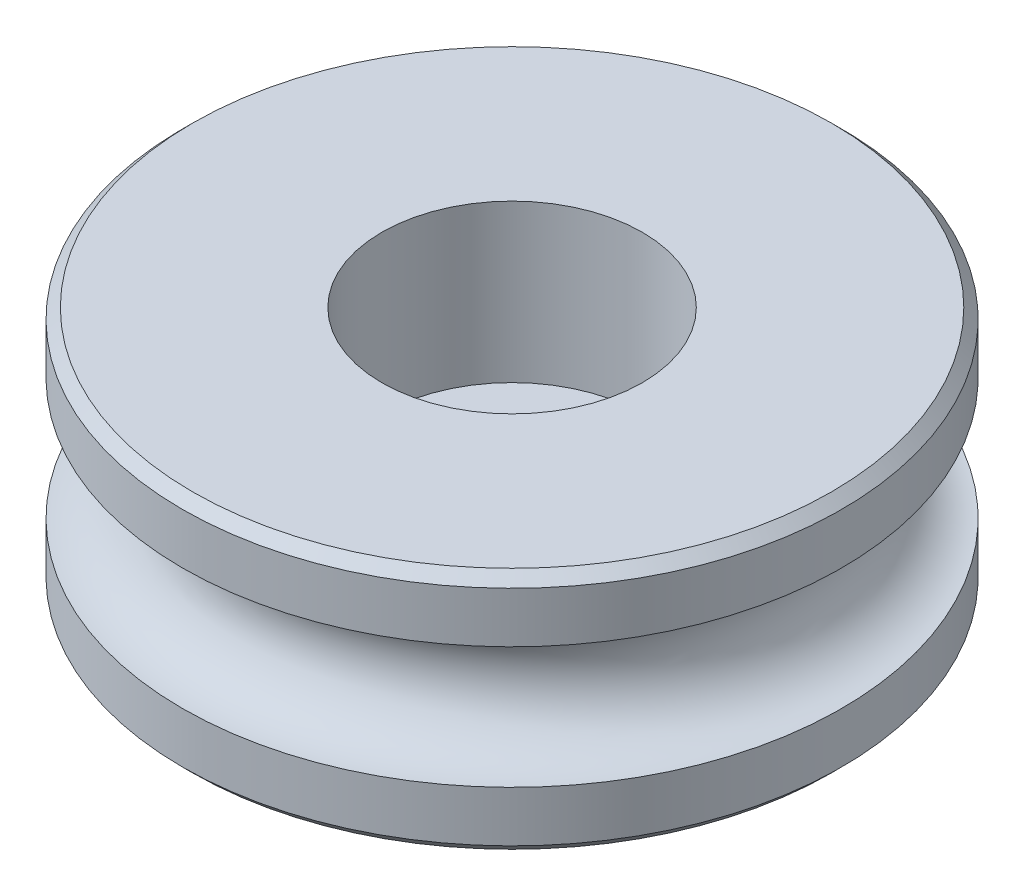
ISO-10303-21;
HEADER;
FILE_DESCRIPTION(('STEP AP214'),'2;1');
FILE_NAME('part.step','',(''),(''),'','','');
FILE_SCHEMA(('AUTOMOTIVE_DESIGN { 1 0 10303 214 1 1 1 1 }'));
ENDSEC;
DATA;
#1=APPLICATION_CONTEXT('core data for automotive mechanical design processes');
#2=APPLICATION_PROTOCOL_DEFINITION('international standard','automotive_design',2000,#1);
#3=PRODUCT_CONTEXT('',#1,'mechanical');
#4=PRODUCT('Part','Part','',(#3));
#5=PRODUCT_RELATED_PRODUCT_CATEGORY('part','',(#4));
#6=PRODUCT_DEFINITION_FORMATION('','',#4);
#7=PRODUCT_DEFINITION_CONTEXT('part definition',#1,'design');
#8=PRODUCT_DEFINITION('design','',#6,#7);
#9=PRODUCT_DEFINITION_SHAPE('','',#8);
#10=(LENGTH_UNIT() NAMED_UNIT(*) SI_UNIT(.MILLI.,.METRE.));
#11=(NAMED_UNIT(*) PLANE_ANGLE_UNIT() SI_UNIT($,.RADIAN.));
#12=(NAMED_UNIT(*) SI_UNIT($,.STERADIAN.) SOLID_ANGLE_UNIT());
#13=UNCERTAINTY_MEASURE_WITH_UNIT(LENGTH_MEASURE(1.E-05),#10,'distance_accuracy_value','');
#14=(GEOMETRIC_REPRESENTATION_CONTEXT(3) GLOBAL_UNCERTAINTY_ASSIGNED_CONTEXT((#13)) GLOBAL_UNIT_ASSIGNED_CONTEXT((#10,
#11,#12)) REPRESENTATION_CONTEXT('',''));
#15=CARTESIAN_POINT('',(0.,0.,0.));
#16=DIRECTION('',(0.,0.,1.));
#17=DIRECTION('',(1.,0.,0.));
#18=AXIS2_PLACEMENT_3D('',#15,#16,#17);
#19=CARTESIAN_POINT('',(2.22044604925031E-12,11.9999999999987,8.88178419700125E-13));
#20=DIRECTION('',(0.,1.,0.));
#21=DIRECTION('',(0.,0.,1.));
#22=AXIS2_PLACEMENT_3D('',#19,#20,#21);
#23=TOROIDAL_SURFACE('',#22,32.5,6.);
#24=CARTESIAN_POINT('',(0.,17.9999999999962,-4.44089209850063E-13));
#25=DIRECTION('',(0.,1.,0.));
#26=DIRECTION('',(0.,0.,1.));
#27=AXIS2_PLACEMENT_3D('',#24,#25,#26);
#28=CIRCLE('',#27,32.5);
#29=CARTESIAN_POINT('',(0.,17.9999999999962,32.4999999999996));
#30=VERTEX_POINT('',#29);
#31=EDGE_CURVE('E10',#30,#30,#28,.T.);
#32=ORIENTED_EDGE('',*,*,#31,.F.);
#33=EDGE_LOOP('',(#32));
#34=FACE_BOUND('',#33,.T.);
#35=CARTESIAN_POINT('',(1.33226762955019E-12,6.00000000000112,4.44089209850063E-13));
#36=DIRECTION('',(0.,1.,0.));
#37=DIRECTION('',(0.,0.,1.));
#38=AXIS2_PLACEMENT_3D('',#35,#36,#37);
#39=CIRCLE('',#38,32.5);
#40=CARTESIAN_POINT('',(1.32924846107783E-12,6.00000000000112,32.5000000000005));
#41=VERTEX_POINT('',#40);
#42=EDGE_CURVE('E64',#41,#41,#39,.T.);
#43=ORIENTED_EDGE('',*,*,#42,.T.);
#44=EDGE_LOOP('',(#43));
#45=FACE_BOUND('',#44,.T.);
#46=ADVANCED_FACE('F30',(#34,#45),#23,.F.);
#47=CARTESIAN_POINT('',(8.88178419700125E-13,24.0000000000036,4.44089209850063E-13));
#48=DIRECTION('',(0.,1.,0.));
#49=DIRECTION('',(0.,0.,1.));
#50=AXIS2_PLACEMENT_3D('',#47,#48,#49);
#51=CYLINDRICAL_SURFACE('',#50,32.5);
#52=CARTESIAN_POINT('',(4.44089209850063E-13,22.9999999999997,-4.44089209850063E-13));
#53=DIRECTION('',(0.,1.,0.));
#54=DIRECTION('',(0.,0.,1.));
#55=AXIS2_PLACEMENT_3D('',#52,#53,#54);
#56=CIRCLE('',#55,32.5);
#57=CARTESIAN_POINT('',(4.41070041377705E-13,22.9999999999997,32.4999999999996));
#58=VERTEX_POINT('',#57);
#59=EDGE_CURVE('E36',#58,#58,#56,.T.);
#60=ORIENTED_EDGE('',*,*,#59,.F.);
#61=EDGE_LOOP('',(#60));
#62=FACE_BOUND('',#61,.T.);
#63=ORIENTED_EDGE('',*,*,#31,.T.);
#64=EDGE_LOOP('',(#63));
#65=FACE_BOUND('',#64,.T.);
#66=ADVANCED_FACE('F113',(#62,#65),#51,.T.);
#67=CARTESIAN_POINT('',(4.44089209850063E-13,22.9999999999997,-4.44089209850063E-13));
#68=DIRECTION('',(0.,-1.,0.));
#69=DIRECTION('',(0.,0.,-1.));
#70=AXIS2_PLACEMENT_3D('',#67,#68,#69);
#71=CONICAL_SURFACE('',#70,32.5,0.785398163397448);
#72=CARTESIAN_POINT('',(8.88178419700125E-13,24.0000000000036,4.44089209850063E-13));
#73=DIRECTION('',(0.,1.,0.));
#74=DIRECTION('',(0.,0.,1.));
#75=AXIS2_PLACEMENT_3D('',#72,#73,#74);
#76=CIRCLE('',#75,31.5);
#77=CARTESIAN_POINT('',(8.85252148719224E-13,24.0000000000036,31.5000000000005));
#78=VERTEX_POINT('',#77);
#79=EDGE_CURVE('E40',#78,#78,#76,.T.);
#80=ORIENTED_EDGE('',*,*,#79,.F.);
#81=EDGE_LOOP('',(#80));
#82=FACE_BOUND('',#81,.T.);
#83=ORIENTED_EDGE('',*,*,#59,.T.);
#84=EDGE_LOOP('',(#83));
#85=FACE_BOUND('',#84,.T.);
#86=ADVANCED_FACE('F108',(#82,#85),#71,.T.);
#87=CARTESIAN_POINT('',(31.5000000000003,24.0000000000009,-1.33226762955019E-12));
#88=DIRECTION('',(0.,-1.,0.));
#89=DIRECTION('',(0.,0.,-1.));
#90=AXIS2_PLACEMENT_3D('',#87,#88,#89);
#91=PLANE('',#90);
#92=CARTESIAN_POINT('',(8.88178419700125E-13,24.0000000000036,4.44089209850063E-13));
#93=DIRECTION('',(0.,1.,0.));
#94=DIRECTION('',(0.,0.,1.));
#95=AXIS2_PLACEMENT_3D('',#92,#93,#94);
#96=CIRCLE('',#95,12.85);
#97=CARTESIAN_POINT('',(8.86984686934901E-13,24.0000000000036,12.8500000000005));
#98=VERTEX_POINT('',#97);
#99=EDGE_CURVE('E44',#98,#98,#96,.T.);
#100=ORIENTED_EDGE('',*,*,#99,.F.);
#101=EDGE_LOOP('',(#100));
#102=FACE_BOUND('',#101,.T.);
#103=ORIENTED_EDGE('',*,*,#79,.T.);
#104=EDGE_LOOP('',(#103));
#105=FACE_BOUND('',#104,.T.);
#106=ADVANCED_FACE('F102',(#102,#105),#91,.F.);
#107=CARTESIAN_POINT('',(8.88178419700125E-13,24.0000000000036,4.44089209850063E-13));
#108=DIRECTION('',(0.,1.,0.));
#109=DIRECTION('',(0.,0.,1.));
#110=AXIS2_PLACEMENT_3D('',#107,#108,#109);
#111=CYLINDRICAL_SURFACE('',#110,12.85);
#112=CARTESIAN_POINT('',(2.22044604925031E-12,8.49999999999884,8.88178419700125E-13));
#113=DIRECTION('',(0.,1.,0.));
#114=DIRECTION('',(0.,0.,1.));
#115=AXIS2_PLACEMENT_3D('',#112,#113,#114);
#116=CIRCLE('',#115,12.85);
#117=CARTESIAN_POINT('',(2.21925231648509E-12,8.49999999999884,12.8500000000009));
#118=VERTEX_POINT('',#117);
#119=EDGE_CURVE('E49',#118,#118,#116,.T.);
#120=ORIENTED_EDGE('',*,*,#119,.F.);
#121=EDGE_LOOP('',(#120));
#122=FACE_BOUND('',#121,.T.);
#123=ORIENTED_EDGE('',*,*,#99,.T.);
#124=EDGE_LOOP('',(#123));
#125=FACE_BOUND('',#124,.T.);
#126=ADVANCED_FACE('F96',(#122,#125),#111,.F.);
#127=CARTESIAN_POINT('',(12.8500000000025,8.49999999999973,4.44089209850063E-13));
#128=DIRECTION('',(0.,-1.,0.));
#129=DIRECTION('',(0.,0.,-1.));
#130=AXIS2_PLACEMENT_3D('',#127,#128,#129);
#131=PLANE('',#130);
#132=CARTESIAN_POINT('',(2.22044604925031E-12,8.49999999999884,8.88178419700125E-13));
#133=DIRECTION('',(0.,1.,0.));
#134=DIRECTION('',(0.,0.,1.));
#135=AXIS2_PLACEMENT_3D('',#132,#133,#134);
#136=CIRCLE('',#135,7.);
#137=CARTESIAN_POINT('',(2.21979576681011E-12,8.49999999999884,7.00000000000089));
#138=VERTEX_POINT('',#137);
#139=EDGE_CURVE('E52',#138,#138,#136,.T.);
#140=ORIENTED_EDGE('',*,*,#139,.F.);
#141=EDGE_LOOP('',(#140));
#142=FACE_BOUND('',#141,.T.);
#143=ORIENTED_EDGE('',*,*,#119,.T.);
#144=EDGE_LOOP('',(#143));
#145=FACE_BOUND('',#144,.T.);
#146=ADVANCED_FACE('F90',(#142,#145),#131,.F.);
#147=CARTESIAN_POINT('',(8.88178419700125E-13,24.0000000000036,4.44089209850063E-13));
#148=DIRECTION('',(0.,1.,0.));
#149=DIRECTION('',(0.,0.,1.));
#150=AXIS2_PLACEMENT_3D('',#147,#148,#149);
#151=CYLINDRICAL_SURFACE('',#150,7.);
#152=CARTESIAN_POINT('',(0.,0.,0.));
#153=DIRECTION('',(0.,1.,0.));
#154=DIRECTION('',(0.,0.,1.));
#155=AXIS2_PLACEMENT_3D('',#152,#153,#154);
#156=CIRCLE('',#155,7.);
#157=CARTESIAN_POINT('',(0.,0.,7.));
#158=VERTEX_POINT('',#157);
#159=EDGE_CURVE('E55',#158,#158,#156,.T.);
#160=ORIENTED_EDGE('',*,*,#159,.F.);
#161=EDGE_LOOP('',(#160));
#162=FACE_BOUND('',#161,.T.);
#163=ORIENTED_EDGE('',*,*,#139,.T.);
#164=EDGE_LOOP('',(#163));
#165=FACE_BOUND('',#164,.T.);
#166=ADVANCED_FACE('F84',(#162,#165),#151,.F.);
#167=CARTESIAN_POINT('',(7.00000000000012,8.88178419700125E-13,4.44089209850063E-13));
#168=DIRECTION('',(0.,1.,0.));
#169=DIRECTION('',(0.,0.,1.));
#170=AXIS2_PLACEMENT_3D('',#167,#168,#169);
#171=PLANE('',#170);
#172=CARTESIAN_POINT('',(0.,0.,0.));
#173=DIRECTION('',(0.,1.,0.));
#174=DIRECTION('',(0.,0.,1.));
#175=AXIS2_PLACEMENT_3D('',#172,#173,#174);
#176=CIRCLE('',#175,31.5);
#177=CARTESIAN_POINT('',(0.,0.,31.5));
#178=VERTEX_POINT('',#177);
#179=EDGE_CURVE('E58',#178,#178,#176,.T.);
#180=ORIENTED_EDGE('',*,*,#179,.F.);
#181=EDGE_LOOP('',(#180));
#182=FACE_BOUND('',#181,.T.);
#183=ORIENTED_EDGE('',*,*,#159,.T.);
#184=EDGE_LOOP('',(#183));
#185=FACE_BOUND('',#184,.T.);
#186=ADVANCED_FACE('F78',(#182,#185),#171,.F.);
#187=CARTESIAN_POINT('',(0.,0.,0.));
#188=DIRECTION('',(0.,1.,0.));
#189=DIRECTION('',(0.,0.,1.));
#190=AXIS2_PLACEMENT_3D('',#187,#188,#189);
#191=CONICAL_SURFACE('',#190,31.5,0.785398163397448);
#192=CARTESIAN_POINT('',(-4.44089209850063E-13,0.999999999998558,-4.44089209850063E-13));
#193=DIRECTION('',(0.,1.,0.));
#194=DIRECTION('',(0.,0.,1.));
#195=AXIS2_PLACEMENT_3D('',#192,#193,#194);
#196=CIRCLE('',#195,32.5);
#197=CARTESIAN_POINT('',(-4.47108378322421E-13,0.999999999998558,32.4999999999996));
#198=VERTEX_POINT('',#197);
#199=EDGE_CURVE('E61',#198,#198,#196,.T.);
#200=ORIENTED_EDGE('',*,*,#199,.F.);
#201=EDGE_LOOP('',(#200));
#202=FACE_BOUND('',#201,.T.);
#203=ORIENTED_EDGE('',*,*,#179,.T.);
#204=EDGE_LOOP('',(#203));
#205=FACE_BOUND('',#204,.T.);
#206=ADVANCED_FACE('F72',(#202,#205),#191,.T.);
#207=CARTESIAN_POINT('',(8.88178419700125E-13,24.0000000000036,4.44089209850063E-13));
#208=DIRECTION('',(0.,1.,0.));
#209=DIRECTION('',(0.,0.,1.));
#210=AXIS2_PLACEMENT_3D('',#207,#208,#209);
#211=CYLINDRICAL_SURFACE('',#210,32.5);
#212=ORIENTED_EDGE('',*,*,#42,.F.);
#213=EDGE_LOOP('',(#212));
#214=FACE_BOUND('',#213,.T.);
#215=ORIENTED_EDGE('',*,*,#199,.T.);
#216=EDGE_LOOP('',(#215));
#217=FACE_BOUND('',#216,.T.);
#218=ADVANCED_FACE('F69',(#214,#217),#211,.T.);
#219=CLOSED_SHELL('',(#46,#66,#86,#106,#126,#146,#166,#186,#206,#218));
#220=MANIFOLD_SOLID_BREP('B2',#219);
#221=ADVANCED_BREP_SHAPE_REPRESENTATION('',(#18,#220),#14);
#222=SHAPE_DEFINITION_REPRESENTATION(#9,#221);
ENDSEC;
END-ISO-10303-21;
